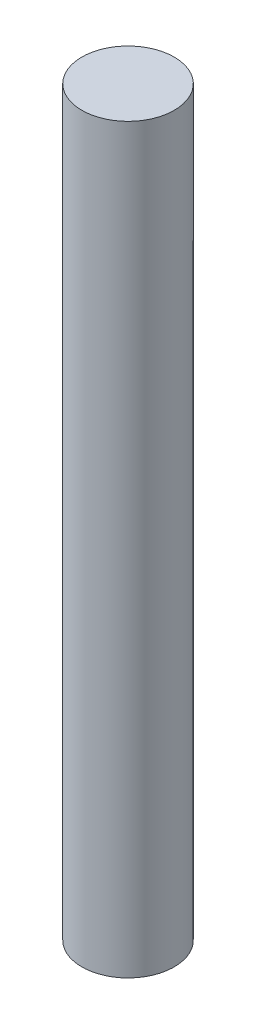
ISO-10303-21;
HEADER;
FILE_DESCRIPTION(('STEP AP214'),'2;1');
FILE_NAME('part.step','',(''),(''),'','','');
FILE_SCHEMA(('AUTOMOTIVE_DESIGN { 1 0 10303 214 1 1 1 1 }'));
ENDSEC;
DATA;
#1=APPLICATION_CONTEXT('core data for automotive mechanical design processes');
#2=APPLICATION_PROTOCOL_DEFINITION('international standard','automotive_design',2000,#1);
#3=PRODUCT_CONTEXT('',#1,'mechanical');
#4=PRODUCT('Part','Part','',(#3));
#5=PRODUCT_RELATED_PRODUCT_CATEGORY('part','',(#4));
#6=PRODUCT_DEFINITION_FORMATION('','',#4);
#7=PRODUCT_DEFINITION_CONTEXT('part definition',#1,'design');
#8=PRODUCT_DEFINITION('design','',#6,#7);
#9=PRODUCT_DEFINITION_SHAPE('','',#8);
#10=(LENGTH_UNIT() NAMED_UNIT(*) SI_UNIT(.MILLI.,.METRE.));
#11=(NAMED_UNIT(*) PLANE_ANGLE_UNIT() SI_UNIT($,.RADIAN.));
#12=(NAMED_UNIT(*) SI_UNIT($,.STERADIAN.) SOLID_ANGLE_UNIT());
#13=UNCERTAINTY_MEASURE_WITH_UNIT(LENGTH_MEASURE(1.E-05),#10,'distance_accuracy_value','');
#14=(GEOMETRIC_REPRESENTATION_CONTEXT(3) GLOBAL_UNCERTAINTY_ASSIGNED_CONTEXT((#13)) GLOBAL_UNIT_ASSIGNED_CONTEXT((#10,
#11,#12)) REPRESENTATION_CONTEXT('',''));
#15=CARTESIAN_POINT('',(0.,0.,0.));
#16=DIRECTION('',(0.,0.,1.));
#17=DIRECTION('',(1.,0.,0.));
#18=AXIS2_PLACEMENT_3D('',#15,#16,#17);
#19=CARTESIAN_POINT('',(36.7002215966535,56.1730574429477,-1.397));
#20=DIRECTION('',(0.,-1.,0.));
#21=DIRECTION('',(0.,0.,-1.));
#22=AXIS2_PLACEMENT_3D('',#19,#20,#21);
#23=CYLINDRICAL_SURFACE('',#22,2.9845);
#24=CARTESIAN_POINT('',(36.7002215966535,47.4141166891427,-1.397));
#25=DIRECTION('',(0.,-1.,0.));
#26=DIRECTION('',(0.,0.,-1.));
#27=AXIS2_PLACEMENT_3D('',#24,#25,#26);
#28=CIRCLE('',#27,2.9845);
#29=CARTESIAN_POINT('',(36.7002215966535,47.4141166891427,-4.3815));
#30=VERTEX_POINT('',#29);
#31=EDGE_CURVE('E10',#30,#30,#28,.F.);
#32=ORIENTED_EDGE('',*,*,#31,.F.);
#33=EDGE_LOOP('',(#32));
#34=FACE_BOUND('',#33,.T.);
#35=CARTESIAN_POINT('',(36.7002215966535,-0.528383310857347,-1.397));
#36=DIRECTION('',(0.,-1.,0.));
#37=DIRECTION('',(0.,0.,-1.));
#38=AXIS2_PLACEMENT_3D('',#35,#36,#37);
#39=CIRCLE('',#38,2.9845);
#40=CARTESIAN_POINT('',(36.7002215966535,-0.528383310857347,-4.3815));
#41=VERTEX_POINT('',#40);
#42=EDGE_CURVE('E41',#41,#41,#39,.T.);
#43=ORIENTED_EDGE('',*,*,#42,.F.);
#44=EDGE_LOOP('',(#43));
#45=FACE_BOUND('',#44,.T.);
#46=ADVANCED_FACE('F35',(#34,#45),#23,.T.);
#47=CARTESIAN_POINT('',(36.7002215966535,47.4141166891427,-1.397));
#48=DIRECTION('',(0.,-1.,0.));
#49=DIRECTION('',(0.,0.,-1.));
#50=AXIS2_PLACEMENT_3D('',#47,#48,#49);
#51=PLANE('',#50);
#52=ORIENTED_EDGE('',*,*,#31,.T.);
#53=EDGE_LOOP('',(#52));
#54=FACE_BOUND('',#53,.T.);
#55=ADVANCED_FACE('F50',(#54),#51,.F.);
#56=CARTESIAN_POINT('',(36.7002215966535,-0.528383310857347,-1.397));
#57=DIRECTION('',(0.,-1.,0.));
#58=DIRECTION('',(0.,0.,-1.));
#59=AXIS2_PLACEMENT_3D('',#56,#57,#58);
#60=PLANE('',#59);
#61=ORIENTED_EDGE('',*,*,#42,.T.);
#62=EDGE_LOOP('',(#61));
#63=FACE_BOUND('',#62,.T.);
#64=ADVANCED_FACE('F47',(#63),#60,.T.);
#65=CLOSED_SHELL('',(#46,#55,#64));
#66=MANIFOLD_SOLID_BREP('B2',#65);
#67=ADVANCED_BREP_SHAPE_REPRESENTATION('',(#18,#66),#14);
#68=SHAPE_DEFINITION_REPRESENTATION(#9,#67);
ENDSEC;
END-ISO-10303-21;
